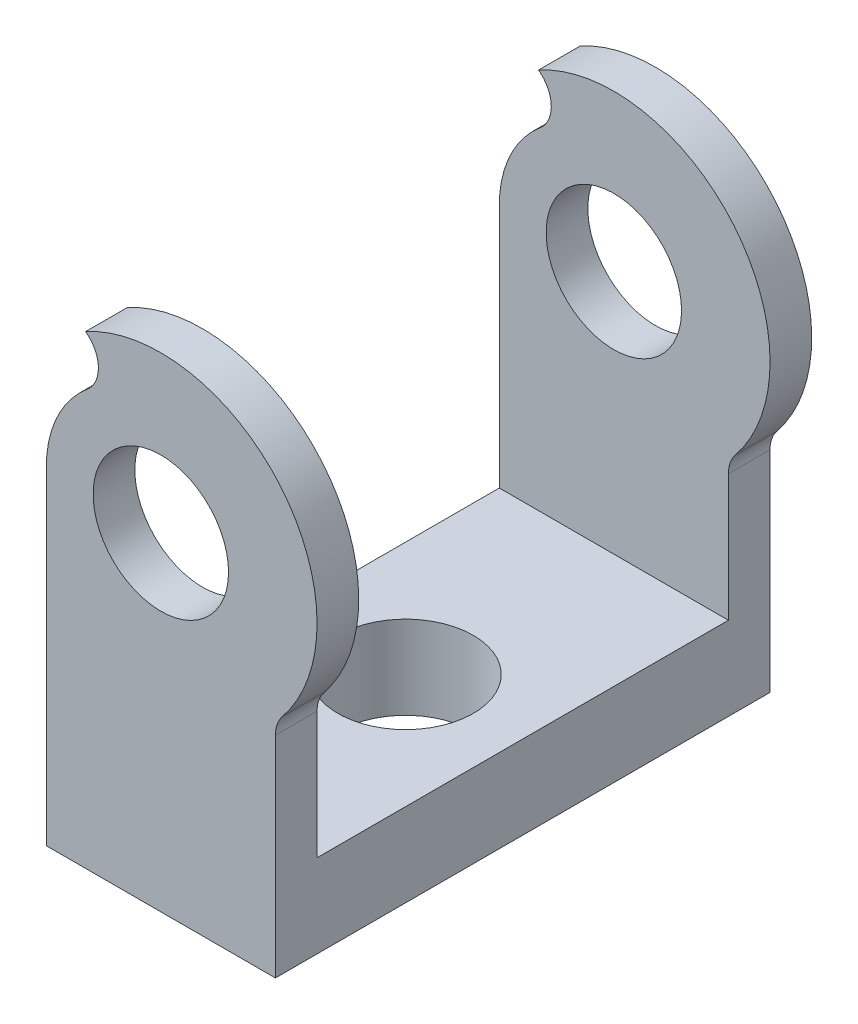
ISO-10303-21;
HEADER;
FILE_DESCRIPTION(('STEP AP214'),'2;1');
FILE_NAME('part.step','',(''),(''),'','','');
FILE_SCHEMA(('AUTOMOTIVE_DESIGN { 1 0 10303 214 1 1 1 1 }'));
ENDSEC;
DATA;
#1=APPLICATION_CONTEXT('core data for automotive mechanical design processes');
#2=APPLICATION_PROTOCOL_DEFINITION('international standard','automotive_design',2000,#1);
#3=PRODUCT_CONTEXT('',#1,'mechanical');
#4=PRODUCT('Part','Part','',(#3));
#5=PRODUCT_RELATED_PRODUCT_CATEGORY('part','',(#4));
#6=PRODUCT_DEFINITION_FORMATION('','',#4);
#7=PRODUCT_DEFINITION_CONTEXT('part definition',#1,'design');
#8=PRODUCT_DEFINITION('design','',#6,#7);
#9=PRODUCT_DEFINITION_SHAPE('','',#8);
#10=(LENGTH_UNIT() NAMED_UNIT(*) SI_UNIT(.MILLI.,.METRE.));
#11=(NAMED_UNIT(*) PLANE_ANGLE_UNIT() SI_UNIT($,.RADIAN.));
#12=(NAMED_UNIT(*) SI_UNIT($,.STERADIAN.) SOLID_ANGLE_UNIT());
#13=UNCERTAINTY_MEASURE_WITH_UNIT(LENGTH_MEASURE(1.E-05),#10,'distance_accuracy_value','');
#14=(GEOMETRIC_REPRESENTATION_CONTEXT(3) GLOBAL_UNCERTAINTY_ASSIGNED_CONTEXT((#13)) GLOBAL_UNIT_ASSIGNED_CONTEXT((#10,
#11,#12)) REPRESENTATION_CONTEXT('',''));
#15=CARTESIAN_POINT('',(0.,0.,0.));
#16=DIRECTION('',(0.,0.,1.));
#17=DIRECTION('',(1.,0.,0.));
#18=AXIS2_PLACEMENT_3D('',#15,#16,#17);
#19=CARTESIAN_POINT('',(0.,0.,4.));
#20=DIRECTION('',(1.,0.,0.));
#21=DIRECTION('',(0.,0.,-1.));
#22=AXIS2_PLACEMENT_3D('',#19,#20,#21);
#23=PLANE('',#22);
#24=DIRECTION('',(0.,-1.,0.));
#25=VECTOR('',#24,1.);
#26=CARTESIAN_POINT('',(0.,0.,0.));
#27=LINE('',#26,#25);
#28=CARTESIAN_POINT('',(0.,31.5,0.));
#29=VERTEX_POINT('',#28);
#30=CARTESIAN_POINT('',(0.,0.,0.));
#31=VERTEX_POINT('',#30);
#32=EDGE_CURVE('E152',#29,#31,#27,.T.);
#33=ORIENTED_EDGE('',*,*,#32,.T.);
#34=DIRECTION('',(0.,0.,-1.));
#35=VECTOR('',#34,1.);
#36=CARTESIAN_POINT('',(0.,0.,4.));
#37=LINE('',#36,#35);
#38=CARTESIAN_POINT('',(0.,0.,47.5));
#39=VERTEX_POINT('',#38);
#40=EDGE_CURVE('E145',#39,#31,#37,.T.);
#41=ORIENTED_EDGE('',*,*,#40,.F.);
#42=DIRECTION('',(0.,-1.,0.));
#43=VECTOR('',#42,1.);
#44=CARTESIAN_POINT('',(0.,0.,47.5));
#45=LINE('',#44,#43);
#46=CARTESIAN_POINT('',(0.,31.5,47.5));
#47=VERTEX_POINT('',#46);
#48=EDGE_CURVE('E149',#47,#39,#45,.T.);
#49=ORIENTED_EDGE('',*,*,#48,.F.);
#50=DIRECTION('',(0.,0.,-1.));
#51=VECTOR('',#50,1.);
#52=CARTESIAN_POINT('',(0.,31.5,47.5));
#53=LINE('',#52,#51);
#54=CARTESIAN_POINT('',(0.,31.5,43.5));
#55=VERTEX_POINT('',#54);
#56=EDGE_CURVE('E192',#47,#55,#53,.T.);
#57=ORIENTED_EDGE('',*,*,#56,.T.);
#58=DIRECTION('',(0.,-1.,0.));
#59=VECTOR('',#58,1.);
#60=CARTESIAN_POINT('',(0.,0.,43.5));
#61=LINE('',#60,#59);
#62=CARTESIAN_POINT('',(0.,8.,43.5));
#63=VERTEX_POINT('',#62);
#64=EDGE_CURVE('E193',#55,#63,#61,.T.);
#65=ORIENTED_EDGE('',*,*,#64,.T.);
#66=DIRECTION('',(0.,0.,-1.));
#67=VECTOR('',#66,1.);
#68=CARTESIAN_POINT('',(0.,8.,43.5));
#69=LINE('',#68,#67);
#70=CARTESIAN_POINT('',(0.,8.,4.));
#71=VERTEX_POINT('',#70);
#72=EDGE_CURVE('E221',#63,#71,#69,.T.);
#73=ORIENTED_EDGE('',*,*,#72,.T.);
#74=DIRECTION('',(0.,-1.,0.));
#75=VECTOR('',#74,1.);
#76=CARTESIAN_POINT('',(0.,0.,4.));
#77=LINE('',#76,#75);
#78=CARTESIAN_POINT('',(0.,31.5,4.));
#79=VERTEX_POINT('',#78);
#80=EDGE_CURVE('E232',#79,#71,#77,.T.);
#81=ORIENTED_EDGE('',*,*,#80,.F.);
#82=DIRECTION('',(0.,0.,-1.));
#83=VECTOR('',#82,1.);
#84=CARTESIAN_POINT('',(0.,31.5,4.));
#85=LINE('',#84,#83);
#86=EDGE_CURVE('E248',#79,#29,#85,.T.);
#87=ORIENTED_EDGE('',*,*,#86,.T.);
#88=EDGE_LOOP('',(#33,#41,#49,#57,#65,#73,#81,#87));
#89=FACE_BOUND('',#88,.T.);
#90=ADVANCED_FACE('F43',(#89),#23,.F.);
#91=CARTESIAN_POINT('',(0.,0.,4.));
#92=DIRECTION('',(0.,1.,0.));
#93=DIRECTION('',(0.,0.,1.));
#94=AXIS2_PLACEMENT_3D('',#91,#92,#93);
#95=PLANE('',#94);
#96=CARTESIAN_POINT('',(11.,0.,24.));
#97=DIRECTION('',(0.,-1.,0.));
#98=DIRECTION('',(0.,0.,-1.));
#99=AXIS2_PLACEMENT_3D('',#96,#97,#98);
#100=CIRCLE('',#99,6.5);
#101=CARTESIAN_POINT('',(11.,0.,17.5));
#102=VERTEX_POINT('',#101);
#103=EDGE_CURVE('E388',#102,#102,#100,.T.);
#104=ORIENTED_EDGE('',*,*,#103,.F.);
#105=EDGE_LOOP('',(#104));
#106=FACE_BOUND('',#105,.T.);
#107=DIRECTION('',(1.,0.,0.));
#108=VECTOR('',#107,1.);
#109=CARTESIAN_POINT('',(0.,0.,0.));
#110=LINE('',#109,#108);
#111=CARTESIAN_POINT('',(22.,0.,0.));
#112=VERTEX_POINT('',#111);
#113=EDGE_CURVE('E251',#31,#112,#110,.T.);
#114=ORIENTED_EDGE('',*,*,#113,.T.);
#115=DIRECTION('',(0.,0.,-1.));
#116=VECTOR('',#115,1.);
#117=CARTESIAN_POINT('',(22.,0.,4.));
#118=LINE('',#117,#116);
#119=CARTESIAN_POINT('',(22.,0.,47.5));
#120=VERTEX_POINT('',#119);
#121=EDGE_CURVE('E156',#120,#112,#118,.T.);
#122=ORIENTED_EDGE('',*,*,#121,.F.);
#123=DIRECTION('',(1.,0.,0.));
#124=VECTOR('',#123,1.);
#125=CARTESIAN_POINT('',(0.,0.,47.5));
#126=LINE('',#125,#124);
#127=EDGE_CURVE('E159',#39,#120,#126,.T.);
#128=ORIENTED_EDGE('',*,*,#127,.F.);
#129=ORIENTED_EDGE('',*,*,#40,.T.);
#130=EDGE_LOOP('',(#114,#122,#128,#129));
#131=FACE_BOUND('',#130,.T.);
#132=ADVANCED_FACE('F160',(#106,#131),#95,.F.);
#133=CARTESIAN_POINT('',(22.,0.,4.));
#134=DIRECTION('',(-1.,0.,0.));
#135=DIRECTION('',(0.,0.,1.));
#136=AXIS2_PLACEMENT_3D('',#133,#134,#135);
#137=PLANE('',#136);
#138=DIRECTION('',(0.,1.,0.));
#139=VECTOR('',#138,1.);
#140=CARTESIAN_POINT('',(22.,0.,43.5));
#141=LINE('',#140,#139);
#142=CARTESIAN_POINT('',(22.,8.,43.5));
#143=VERTEX_POINT('',#142);
#144=CARTESIAN_POINT('',(22.,20.1862915010152,43.5));
#145=VERTEX_POINT('',#144);
#146=EDGE_CURVE('E197',#143,#145,#141,.T.);
#147=ORIENTED_EDGE('',*,*,#146,.T.);
#148=DIRECTION('',(0.,0.,1.));
#149=VECTOR('',#148,1.);
#150=CARTESIAN_POINT('',(22.,20.1862915010152,47.5));
#151=LINE('',#150,#149);
#152=CARTESIAN_POINT('',(22.,20.1862915010152,47.5));
#153=VERTEX_POINT('',#152);
#154=EDGE_CURVE('E284',#145,#153,#151,.T.);
#155=ORIENTED_EDGE('',*,*,#154,.T.);
#156=DIRECTION('',(0.,1.,0.));
#157=VECTOR('',#156,1.);
#158=CARTESIAN_POINT('',(22.,0.,47.5));
#159=LINE('',#158,#157);
#160=EDGE_CURVE('E166',#120,#153,#159,.T.);
#161=ORIENTED_EDGE('',*,*,#160,.F.);
#162=ORIENTED_EDGE('',*,*,#121,.T.);
#163=DIRECTION('',(0.,1.,0.));
#164=VECTOR('',#163,1.);
#165=CARTESIAN_POINT('',(22.,0.,0.));
#166=LINE('',#165,#164);
#167=CARTESIAN_POINT('',(22.,20.1862915010152,0.));
#168=VERTEX_POINT('',#167);
#169=EDGE_CURVE('E254',#112,#168,#166,.T.);
#170=ORIENTED_EDGE('',*,*,#169,.T.);
#171=DIRECTION('',(0.,0.,1.));
#172=VECTOR('',#171,1.);
#173=CARTESIAN_POINT('',(22.,20.1862915010152,4.));
#174=LINE('',#173,#172);
#175=CARTESIAN_POINT('',(22.,20.1862915010152,4.));
#176=VERTEX_POINT('',#175);
#177=EDGE_CURVE('E281',#168,#176,#174,.T.);
#178=ORIENTED_EDGE('',*,*,#177,.T.);
#179=DIRECTION('',(0.,1.,0.));
#180=VECTOR('',#179,1.);
#181=CARTESIAN_POINT('',(22.,0.,4.));
#182=LINE('',#181,#180);
#183=CARTESIAN_POINT('',(22.,8.,4.));
#184=VERTEX_POINT('',#183);
#185=EDGE_CURVE('E235',#184,#176,#182,.T.);
#186=ORIENTED_EDGE('',*,*,#185,.F.);
#187=DIRECTION('',(0.,0.,-1.));
#188=VECTOR('',#187,1.);
#189=CARTESIAN_POINT('',(22.,8.,43.5));
#190=LINE('',#189,#188);
#191=EDGE_CURVE('E228',#143,#184,#190,.T.);
#192=ORIENTED_EDGE('',*,*,#191,.F.);
#193=EDGE_LOOP('',(#147,#155,#161,#162,#170,#178,#186,#192));
#194=FACE_BOUND('',#193,.T.);
#195=ADVANCED_FACE('F302',(#194),#137,.F.);
#196=CARTESIAN_POINT('',(11.,31.5,4.));
#197=DIRECTION('',(0.,0.,-1.));
#198=DIRECTION('',(-1.,0.,0.));
#199=AXIS2_PLACEMENT_3D('',#196,#197,#198);
#200=CYLINDRICAL_SURFACE('',#199,15.);
#201=CARTESIAN_POINT('',(11.,31.5,4.));
#202=DIRECTION('',(0.,0.,1.));
#203=DIRECTION('',(1.,0.,0.));
#204=AXIS2_PLACEMENT_3D('',#201,#202,#203);
#205=CIRCLE('',#204,15.);
#206=CARTESIAN_POINT('',(22.6666666666667,22.0719095841794,4.));
#207=VERTEX_POINT('',#206);
#208=CARTESIAN_POINT('',(3.76462961115535,44.6396124500013,4.));
#209=VERTEX_POINT('',#208);
#210=EDGE_CURVE('E239',#207,#209,#205,.T.);
#211=ORIENTED_EDGE('',*,*,#210,.F.);
#212=DIRECTION('',(0.,0.,-1.));
#213=VECTOR('',#212,1.);
#214=CARTESIAN_POINT('',(22.6666666666667,22.0719095841794,4.));
#215=LINE('',#214,#213);
#216=CARTESIAN_POINT('',(22.6666666666667,22.0719095841794,0.));
#217=VERTEX_POINT('',#216);
#218=EDGE_CURVE('E287',#207,#217,#215,.T.);
#219=ORIENTED_EDGE('',*,*,#218,.T.);
#220=CARTESIAN_POINT('',(11.,31.5,0.));
#221=DIRECTION('',(0.,0.,1.));
#222=DIRECTION('',(1.,0.,0.));
#223=AXIS2_PLACEMENT_3D('',#220,#221,#222);
#224=CIRCLE('',#223,15.);
#225=CARTESIAN_POINT('',(3.76462961115535,44.6396124500013,0.));
#226=VERTEX_POINT('',#225);
#227=EDGE_CURVE('E258',#217,#226,#224,.T.);
#228=ORIENTED_EDGE('',*,*,#227,.T.);
#229=DIRECTION('',(0.,0.,-1.));
#230=VECTOR('',#229,1.);
#231=CARTESIAN_POINT('',(3.76462961115535,44.6396124500013,4.));
#232=LINE('',#231,#230);
#233=EDGE_CURVE('E272',#209,#226,#232,.T.);
#234=ORIENTED_EDGE('',*,*,#233,.F.);
#235=EDGE_LOOP('',(#211,#219,#228,#234));
#236=FACE_BOUND('',#235,.T.);
#237=ADVANCED_FACE('F305',(#236),#200,.T.);
#238=CARTESIAN_POINT('',(1.993424789463,42.2182835835287,4.));
#239=DIRECTION('',(0.,0.,-1.));
#240=DIRECTION('',(-1.,0.,0.));
#241=AXIS2_PLACEMENT_3D('',#238,#239,#240);
#242=CYLINDRICAL_SURFACE('',#241,3.);
#243=CARTESIAN_POINT('',(1.993424789463,42.2182835835287,0.));
#244=DIRECTION('',(0.,0.,-1.));
#245=DIRECTION('',(1.,0.,0.));
#246=AXIS2_PLACEMENT_3D('',#243,#244,#245);
#247=CIRCLE('',#246,3.);
#248=CARTESIAN_POINT('',(3.92340519172093,39.9215085299154,0.));
#249=VERTEX_POINT('',#248);
#250=EDGE_CURVE('E261',#226,#249,#247,.T.);
#251=ORIENTED_EDGE('',*,*,#250,.T.);
#252=DIRECTION('',(0.,0.,-1.));
#253=VECTOR('',#252,1.);
#254=CARTESIAN_POINT('',(3.92340519172093,39.9215085299154,4.));
#255=LINE('',#254,#253);
#256=CARTESIAN_POINT('',(3.92340519172093,39.9215085299154,4.));
#257=VERTEX_POINT('',#256);
#258=EDGE_CURVE('E268',#257,#249,#255,.T.);
#259=ORIENTED_EDGE('',*,*,#258,.F.);
#260=CARTESIAN_POINT('',(1.993424789463,42.2182835835287,4.));
#261=DIRECTION('',(0.,0.,-1.));
#262=DIRECTION('',(1.,0.,0.));
#263=AXIS2_PLACEMENT_3D('',#260,#261,#262);
#264=CIRCLE('',#263,3.);
#265=EDGE_CURVE('E242',#209,#257,#264,.T.);
#266=ORIENTED_EDGE('',*,*,#265,.F.);
#267=ORIENTED_EDGE('',*,*,#233,.T.);
#268=EDGE_LOOP('',(#251,#259,#266,#267));
#269=FACE_BOUND('',#268,.T.);
#270=ADVANCED_FACE('F313',(#269),#242,.F.);
#271=CARTESIAN_POINT('',(11.,31.5,4.));
#272=DIRECTION('',(0.,0.,-1.));
#273=DIRECTION('',(-1.,0.,0.));
#274=AXIS2_PLACEMENT_3D('',#271,#272,#273);
#275=CYLINDRICAL_SURFACE('',#274,11.);
#276=CARTESIAN_POINT('',(11.,31.5,0.));
#277=DIRECTION('',(0.,0.,1.));
#278=DIRECTION('',(1.,0.,0.));
#279=AXIS2_PLACEMENT_3D('',#276,#277,#278);
#280=CIRCLE('',#279,11.);
#281=EDGE_CURVE('E236',#249,#29,#280,.T.);
#282=ORIENTED_EDGE('',*,*,#281,.T.);
#283=ORIENTED_EDGE('',*,*,#86,.F.);
#284=CARTESIAN_POINT('',(11.,31.5,4.));
#285=DIRECTION('',(0.,0.,1.));
#286=DIRECTION('',(1.,0.,0.));
#287=AXIS2_PLACEMENT_3D('',#284,#285,#286);
#288=CIRCLE('',#287,11.);
#289=EDGE_CURVE('E245',#257,#79,#288,.T.);
#290=ORIENTED_EDGE('',*,*,#289,.F.);
#291=ORIENTED_EDGE('',*,*,#258,.T.);
#292=EDGE_LOOP('',(#282,#283,#290,#291));
#293=FACE_BOUND('',#292,.T.);
#294=ADVANCED_FACE('F316',(#293),#275,.T.);
#295=CARTESIAN_POINT('',(11.,31.5,4.));
#296=DIRECTION('',(0.,0.,1.));
#297=DIRECTION('',(1.,0.,0.));
#298=AXIS2_PLACEMENT_3D('',#295,#296,#297);
#299=PLANE('',#298);
#300=CARTESIAN_POINT('',(11.,31.5,4.));
#301=DIRECTION('',(0.,0.,1.));
#302=DIRECTION('',(1.,0.,0.));
#303=AXIS2_PLACEMENT_3D('',#300,#301,#302);
#304=CIRCLE('',#303,6.5);
#305=CARTESIAN_POINT('',(17.5,31.5,4.));
#306=VERTEX_POINT('',#305);
#307=EDGE_CURVE('E179',#306,#306,#304,.T.);
#308=ORIENTED_EDGE('',*,*,#307,.F.);
#309=EDGE_LOOP('',(#308));
#310=FACE_BOUND('',#309,.T.);
#311=DIRECTION('',(-1.,0.,0.));
#312=VECTOR('',#311,1.);
#313=CARTESIAN_POINT('',(0.,8.,4.));
#314=LINE('',#313,#312);
#315=EDGE_CURVE('E216',#184,#71,#314,.T.);
#316=ORIENTED_EDGE('',*,*,#315,.F.);
#317=ORIENTED_EDGE('',*,*,#185,.T.);
#318=CARTESIAN_POINT('',(25.,20.1862915010152,4.));
#319=DIRECTION('',(0.,0.,1.));
#320=DIRECTION('',(1.,0.,0.));
#321=AXIS2_PLACEMENT_3D('',#318,#319,#320);
#322=CIRCLE('',#321,3.);
#323=EDGE_CURVE('E11',#176,#207,#322,.F.);
#324=ORIENTED_EDGE('',*,*,#323,.T.);
#325=ORIENTED_EDGE('',*,*,#210,.T.);
#326=ORIENTED_EDGE('',*,*,#265,.T.);
#327=ORIENTED_EDGE('',*,*,#289,.T.);
#328=ORIENTED_EDGE('',*,*,#80,.T.);
#329=EDGE_LOOP('',(#316,#317,#324,#325,#326,#327,#328));
#330=FACE_BOUND('',#329,.T.);
#331=ADVANCED_FACE('F308',(#310,#330),#299,.T.);
#332=CARTESIAN_POINT('',(11.,31.5,0.));
#333=DIRECTION('',(0.,0.,1.));
#334=DIRECTION('',(1.,0.,0.));
#335=AXIS2_PLACEMENT_3D('',#332,#333,#334);
#336=PLANE('',#335);
#337=CARTESIAN_POINT('',(11.,31.5,0.));
#338=DIRECTION('',(0.,0.,1.));
#339=DIRECTION('',(1.,0.,0.));
#340=AXIS2_PLACEMENT_3D('',#337,#338,#339);
#341=CIRCLE('',#340,6.5);
#342=CARTESIAN_POINT('',(17.5,31.5,0.));
#343=VERTEX_POINT('',#342);
#344=EDGE_CURVE('E398',#343,#343,#341,.T.);
#345=ORIENTED_EDGE('',*,*,#344,.T.);
#346=EDGE_LOOP('',(#345));
#347=FACE_BOUND('',#346,.T.);
#348=ORIENTED_EDGE('',*,*,#32,.F.);
#349=ORIENTED_EDGE('',*,*,#281,.F.);
#350=ORIENTED_EDGE('',*,*,#250,.F.);
#351=ORIENTED_EDGE('',*,*,#227,.F.);
#352=CARTESIAN_POINT('',(25.,20.1862915010152,0.));
#353=DIRECTION('',(0.,0.,1.));
#354=DIRECTION('',(1.,0.,0.));
#355=AXIS2_PLACEMENT_3D('',#352,#353,#354);
#356=CIRCLE('',#355,3.);
#357=EDGE_CURVE('E52',#217,#168,#356,.T.);
#358=ORIENTED_EDGE('',*,*,#357,.T.);
#359=ORIENTED_EDGE('',*,*,#169,.F.);
#360=ORIENTED_EDGE('',*,*,#113,.F.);
#361=EDGE_LOOP('',(#348,#349,#350,#351,#358,#359,#360));
#362=FACE_BOUND('',#361,.T.);
#363=ADVANCED_FACE('F299',(#347,#362),#336,.F.);
#364=CARTESIAN_POINT('',(0.,8.,43.5));
#365=DIRECTION('',(0.,-1.,0.));
#366=DIRECTION('',(0.,0.,-1.));
#367=AXIS2_PLACEMENT_3D('',#364,#365,#366);
#368=PLANE('',#367);
#369=CARTESIAN_POINT('',(11.,8.,24.));
#370=DIRECTION('',(0.,-1.,0.));
#371=DIRECTION('',(0.,0.,-1.));
#372=AXIS2_PLACEMENT_3D('',#369,#370,#371);
#373=CIRCLE('',#372,6.5);
#374=CARTESIAN_POINT('',(11.,8.,17.5));
#375=VERTEX_POINT('',#374);
#376=EDGE_CURVE('E391',#375,#375,#373,.F.);
#377=ORIENTED_EDGE('',*,*,#376,.F.);
#378=EDGE_LOOP('',(#377));
#379=FACE_BOUND('',#378,.T.);
#380=ORIENTED_EDGE('',*,*,#315,.T.);
#381=ORIENTED_EDGE('',*,*,#72,.F.);
#382=DIRECTION('',(-1.,0.,0.));
#383=VECTOR('',#382,1.);
#384=CARTESIAN_POINT('',(0.,8.,43.5));
#385=LINE('',#384,#383);
#386=EDGE_CURVE('E217',#143,#63,#385,.T.);
#387=ORIENTED_EDGE('',*,*,#386,.F.);
#388=ORIENTED_EDGE('',*,*,#191,.T.);
#389=EDGE_LOOP('',(#380,#381,#387,#388));
#390=FACE_BOUND('',#389,.T.);
#391=ADVANCED_FACE('F319',(#379,#390),#368,.F.);
#392=CARTESIAN_POINT('',(11.,31.5,43.5));
#393=DIRECTION('',(0.,0.,1.));
#394=DIRECTION('',(1.,0.,0.));
#395=AXIS2_PLACEMENT_3D('',#392,#393,#394);
#396=PLANE('',#395);
#397=CARTESIAN_POINT('',(11.,31.5,43.5));
#398=DIRECTION('',(0.,0.,1.));
#399=DIRECTION('',(1.,0.,0.));
#400=AXIS2_PLACEMENT_3D('',#397,#398,#399);
#401=CIRCLE('',#400,6.5);
#402=CARTESIAN_POINT('',(17.5,31.5,43.5));
#403=VERTEX_POINT('',#402);
#404=EDGE_CURVE('E404',#403,#403,#401,.T.);
#405=ORIENTED_EDGE('',*,*,#404,.T.);
#406=EDGE_LOOP('',(#405));
#407=FACE_BOUND('',#406,.T.);
#408=ORIENTED_EDGE('',*,*,#146,.F.);
#409=ORIENTED_EDGE('',*,*,#386,.T.);
#410=ORIENTED_EDGE('',*,*,#64,.F.);
#411=CARTESIAN_POINT('',(11.,31.5,43.5));
#412=DIRECTION('',(0.,0.,1.));
#413=DIRECTION('',(1.,0.,0.));
#414=AXIS2_PLACEMENT_3D('',#411,#412,#413);
#415=CIRCLE('',#414,11.);
#416=CARTESIAN_POINT('',(3.92933629344802,39.9264888743087,43.5));
#417=VERTEX_POINT('',#416);
#418=EDGE_CURVE('E173',#417,#55,#415,.T.);
#419=ORIENTED_EDGE('',*,*,#418,.F.);
#420=CARTESIAN_POINT('',(2.0009734643884,42.2246222036657,43.5));
#421=DIRECTION('',(0.,0.,-1.));
#422=DIRECTION('',(1.,0.,0.));
#423=AXIS2_PLACEMENT_3D('',#420,#421,#422);
#424=CIRCLE('',#423,3.);
#425=CARTESIAN_POINT('',(3.77388263675114,44.6447034144005,43.5));
#426=VERTEX_POINT('',#425);
#427=EDGE_CURVE('E176',#426,#417,#424,.T.);
#428=ORIENTED_EDGE('',*,*,#427,.F.);
#429=CARTESIAN_POINT('',(11.,31.5,43.5));
#430=DIRECTION('',(0.,0.,1.));
#431=DIRECTION('',(1.,0.,0.));
#432=AXIS2_PLACEMENT_3D('',#429,#430,#431);
#433=CIRCLE('',#432,15.);
#434=CARTESIAN_POINT('',(22.6666666666667,22.0719095841794,43.5));
#435=VERTEX_POINT('',#434);
#436=EDGE_CURVE('E201',#435,#426,#433,.T.);
#437=ORIENTED_EDGE('',*,*,#436,.F.);
#438=CARTESIAN_POINT('',(25.,20.1862915010152,43.5));
#439=DIRECTION('',(0.,0.,1.));
#440=DIRECTION('',(1.,0.,0.));
#441=AXIS2_PLACEMENT_3D('',#438,#439,#440);
#442=CIRCLE('',#441,3.);
#443=EDGE_CURVE('E290',#435,#145,#442,.T.);
#444=ORIENTED_EDGE('',*,*,#443,.T.);
#445=EDGE_LOOP('',(#408,#409,#410,#419,#428,#437,#444));
#446=FACE_BOUND('',#445,.T.);
#447=ADVANCED_FACE('F342',(#407,#446),#396,.F.);
#448=CARTESIAN_POINT('',(11.,31.5,47.5));
#449=DIRECTION('',(0.,0.,-1.));
#450=DIRECTION('',(-1.,0.,0.));
#451=AXIS2_PLACEMENT_3D('',#448,#449,#450);
#452=CYLINDRICAL_SURFACE('',#451,15.);
#453=CARTESIAN_POINT('',(11.,31.5,47.5));
#454=DIRECTION('',(0.,0.,1.));
#455=DIRECTION('',(1.,0.,0.));
#456=AXIS2_PLACEMENT_3D('',#453,#454,#455);
#457=CIRCLE('',#456,15.);
#458=CARTESIAN_POINT('',(22.6666666666667,22.0719095841794,47.5));
#459=VERTEX_POINT('',#458);
#460=CARTESIAN_POINT('',(3.77388263675114,44.6447034144005,47.5));
#461=VERTEX_POINT('',#460);
#462=EDGE_CURVE('E184',#459,#461,#457,.T.);
#463=ORIENTED_EDGE('',*,*,#462,.F.);
#464=DIRECTION('',(0.,0.,-1.));
#465=VECTOR('',#464,1.);
#466=CARTESIAN_POINT('',(22.6666666666667,22.0719095841794,47.5));
#467=LINE('',#466,#465);
#468=EDGE_CURVE('E155',#459,#435,#467,.T.);
#469=ORIENTED_EDGE('',*,*,#468,.T.);
#470=ORIENTED_EDGE('',*,*,#436,.T.);
#471=DIRECTION('',(0.,0.,-1.));
#472=VECTOR('',#471,1.);
#473=CARTESIAN_POINT('',(3.77388263675114,44.6447034144005,47.5));
#474=LINE('',#473,#472);
#475=EDGE_CURVE('E212',#461,#426,#474,.T.);
#476=ORIENTED_EDGE('',*,*,#475,.F.);
#477=EDGE_LOOP('',(#463,#469,#470,#476));
#478=FACE_BOUND('',#477,.T.);
#479=ADVANCED_FACE('F331',(#478),#452,.T.);
#480=CARTESIAN_POINT('',(2.0009734643884,42.2246222036657,47.5));
#481=DIRECTION('',(0.,0.,-1.));
#482=DIRECTION('',(-1.,0.,0.));
#483=AXIS2_PLACEMENT_3D('',#480,#481,#482);
#484=CYLINDRICAL_SURFACE('',#483,3.);
#485=ORIENTED_EDGE('',*,*,#427,.T.);
#486=DIRECTION('',(0.,0.,-1.));
#487=VECTOR('',#486,1.);
#488=CARTESIAN_POINT('',(3.92933629344802,39.9264888743087,47.5));
#489=LINE('',#488,#487);
#490=CARTESIAN_POINT('',(3.92933629344802,39.9264888743087,47.5));
#491=VERTEX_POINT('',#490);
#492=EDGE_CURVE('E208',#491,#417,#489,.T.);
#493=ORIENTED_EDGE('',*,*,#492,.F.);
#494=CARTESIAN_POINT('',(2.0009734643884,42.2246222036657,47.5));
#495=DIRECTION('',(0.,0.,-1.));
#496=DIRECTION('',(1.,0.,0.));
#497=AXIS2_PLACEMENT_3D('',#494,#495,#496);
#498=CIRCLE('',#497,3.);
#499=EDGE_CURVE('E187',#461,#491,#498,.T.);
#500=ORIENTED_EDGE('',*,*,#499,.F.);
#501=ORIENTED_EDGE('',*,*,#475,.T.);
#502=EDGE_LOOP('',(#485,#493,#500,#501));
#503=FACE_BOUND('',#502,.T.);
#504=ADVANCED_FACE('F337',(#503),#484,.F.);
#505=CARTESIAN_POINT('',(11.,31.5,47.5));
#506=DIRECTION('',(0.,0.,-1.));
#507=DIRECTION('',(-1.,0.,0.));
#508=AXIS2_PLACEMENT_3D('',#505,#506,#507);
#509=CYLINDRICAL_SURFACE('',#508,11.);
#510=ORIENTED_EDGE('',*,*,#418,.T.);
#511=ORIENTED_EDGE('',*,*,#56,.F.);
#512=CARTESIAN_POINT('',(11.,31.5,47.5));
#513=DIRECTION('',(0.,0.,1.));
#514=DIRECTION('',(1.,0.,0.));
#515=AXIS2_PLACEMENT_3D('',#512,#513,#514);
#516=CIRCLE('',#515,11.);
#517=EDGE_CURVE('E170',#491,#47,#516,.T.);
#518=ORIENTED_EDGE('',*,*,#517,.F.);
#519=ORIENTED_EDGE('',*,*,#492,.T.);
#520=EDGE_LOOP('',(#510,#511,#518,#519));
#521=FACE_BOUND('',#520,.T.);
#522=ADVANCED_FACE('F340',(#521),#509,.T.);
#523=CARTESIAN_POINT('',(11.,31.5,47.5));
#524=DIRECTION('',(0.,0.,1.));
#525=DIRECTION('',(1.,0.,0.));
#526=AXIS2_PLACEMENT_3D('',#523,#524,#525);
#527=PLANE('',#526);
#528=CARTESIAN_POINT('',(11.,31.5,47.5));
#529=DIRECTION('',(0.,0.,1.));
#530=DIRECTION('',(1.,0.,0.));
#531=AXIS2_PLACEMENT_3D('',#528,#529,#530);
#532=CIRCLE('',#531,6.5);
#533=CARTESIAN_POINT('',(17.5,31.5,47.5));
#534=VERTEX_POINT('',#533);
#535=EDGE_CURVE('E393',#534,#534,#532,.T.);
#536=ORIENTED_EDGE('',*,*,#535,.F.);
#537=EDGE_LOOP('',(#536));
#538=FACE_BOUND('',#537,.T.);
#539=ORIENTED_EDGE('',*,*,#48,.T.);
#540=ORIENTED_EDGE('',*,*,#127,.T.);
#541=ORIENTED_EDGE('',*,*,#160,.T.);
#542=CARTESIAN_POINT('',(25.,20.1862915010152,47.5));
#543=DIRECTION('',(0.,0.,1.));
#544=DIRECTION('',(1.,0.,0.));
#545=AXIS2_PLACEMENT_3D('',#542,#543,#544);
#546=CIRCLE('',#545,3.);
#547=EDGE_CURVE('E293',#153,#459,#546,.F.);
#548=ORIENTED_EDGE('',*,*,#547,.T.);
#549=ORIENTED_EDGE('',*,*,#462,.T.);
#550=ORIENTED_EDGE('',*,*,#499,.T.);
#551=ORIENTED_EDGE('',*,*,#517,.T.);
#552=EDGE_LOOP('',(#539,#540,#541,#548,#549,#550,#551));
#553=FACE_BOUND('',#552,.T.);
#554=ADVANCED_FACE('F168',(#538,#553),#527,.T.);
#555=CARTESIAN_POINT('',(25.,20.1862915010152,47.5));
#556=DIRECTION('',(0.,0.,-1.));
#557=DIRECTION('',(-1.,0.,0.));
#558=AXIS2_PLACEMENT_3D('',#555,#556,#557);
#559=CYLINDRICAL_SURFACE('',#558,3.);
#560=ORIENTED_EDGE('',*,*,#547,.F.);
#561=ORIENTED_EDGE('',*,*,#154,.F.);
#562=ORIENTED_EDGE('',*,*,#443,.F.);
#563=ORIENTED_EDGE('',*,*,#468,.F.);
#564=EDGE_LOOP('',(#560,#561,#562,#563));
#565=FACE_BOUND('',#564,.T.);
#566=ADVANCED_FACE('F326',(#565),#559,.F.);
#567=CARTESIAN_POINT('',(25.,20.1862915010152,4.));
#568=DIRECTION('',(0.,0.,-1.));
#569=DIRECTION('',(-1.,0.,0.));
#570=AXIS2_PLACEMENT_3D('',#567,#568,#569);
#571=CYLINDRICAL_SURFACE('',#570,3.);
#572=ORIENTED_EDGE('',*,*,#323,.F.);
#573=ORIENTED_EDGE('',*,*,#177,.F.);
#574=ORIENTED_EDGE('',*,*,#357,.F.);
#575=ORIENTED_EDGE('',*,*,#218,.F.);
#576=EDGE_LOOP('',(#572,#573,#574,#575));
#577=FACE_BOUND('',#576,.T.);
#578=ADVANCED_FACE('F45',(#577),#571,.F.);
#579=CARTESIAN_POINT('',(11.,31.5,0.));
#580=DIRECTION('',(0.,0.,1.));
#581=DIRECTION('',(1.,0.,0.));
#582=AXIS2_PLACEMENT_3D('',#579,#580,#581);
#583=CYLINDRICAL_SURFACE('',#582,6.5);
#584=ORIENTED_EDGE('',*,*,#535,.T.);
#585=EDGE_LOOP('',(#584));
#586=FACE_BOUND('',#585,.T.);
#587=ORIENTED_EDGE('',*,*,#404,.F.);
#588=EDGE_LOOP('',(#587));
#589=FACE_BOUND('',#588,.T.);
#590=ADVANCED_FACE('F369',(#586,#589),#583,.F.);
#591=ORIENTED_EDGE('',*,*,#307,.T.);
#592=EDGE_LOOP('',(#591));
#593=FACE_BOUND('',#592,.T.);
#594=ORIENTED_EDGE('',*,*,#344,.F.);
#595=EDGE_LOOP('',(#594));
#596=FACE_BOUND('',#595,.T.);
#597=ADVANCED_FACE('F376',(#593,#596),#583,.F.);
#598=CARTESIAN_POINT('',(11.,46.501,24.));
#599=DIRECTION('',(0.,-1.,0.));
#600=DIRECTION('',(0.,0.,-1.));
#601=AXIS2_PLACEMENT_3D('',#598,#599,#600);
#602=CYLINDRICAL_SURFACE('',#601,6.5);
#603=CARTESIAN_POINT('',(11.,0.,17.5));
#604=CARTESIAN_POINT('',(11.,0.0833333333333402,17.5));
#605=CARTESIAN_POINT('',(11.,0.166666666666674,17.5));
#606=CARTESIAN_POINT('',(11.,0.333333333333341,17.5));
#607=CARTESIAN_POINT('',(11.,0.416666666666674,17.5));
#608=CARTESIAN_POINT('',(11.,0.583333333333341,17.5));
#609=CARTESIAN_POINT('',(11.,0.666666666666674,17.5));
#610=CARTESIAN_POINT('',(11.,0.833333333333341,17.5));
#611=CARTESIAN_POINT('',(11.,0.916666666666674,17.5));
#612=CARTESIAN_POINT('',(11.,1.08333333333334,17.5));
#613=CARTESIAN_POINT('',(11.,1.16666666666667,17.5));
#614=CARTESIAN_POINT('',(11.,1.33333333333334,17.5));
#615=CARTESIAN_POINT('',(11.,1.41666666666667,17.5));
#616=CARTESIAN_POINT('',(11.,1.58333333333334,17.5));
#617=CARTESIAN_POINT('',(11.,1.66666666666667,17.5));
#618=CARTESIAN_POINT('',(11.,1.83333333333334,17.5));
#619=CARTESIAN_POINT('',(11.,1.91666666666668,17.5));
#620=CARTESIAN_POINT('',(11.,2.08333333333334,17.5));
#621=CARTESIAN_POINT('',(11.,2.16666666666667,17.5));
#622=CARTESIAN_POINT('',(11.,2.33333333333334,17.5));
#623=CARTESIAN_POINT('',(11.,2.41666666666667,17.5));
#624=CARTESIAN_POINT('',(11.,2.58333333333334,17.5));
#625=CARTESIAN_POINT('',(11.,2.66666666666667,17.5));
#626=CARTESIAN_POINT('',(11.,2.83333333333334,17.5));
#627=CARTESIAN_POINT('',(11.,2.91666666666667,17.5));
#628=CARTESIAN_POINT('',(11.,3.08333333333334,17.5));
#629=CARTESIAN_POINT('',(11.,3.16666666666667,17.5));
#630=CARTESIAN_POINT('',(11.,3.33333333333334,17.5));
#631=CARTESIAN_POINT('',(11.,3.41666666666667,17.5));
#632=CARTESIAN_POINT('',(11.,3.58333333333334,17.5));
#633=CARTESIAN_POINT('',(11.,3.66666666666667,17.5));
#634=CARTESIAN_POINT('',(11.,3.83333333333334,17.5));
#635=CARTESIAN_POINT('',(11.,3.91666666666667,17.5));
#636=CARTESIAN_POINT('',(11.,4.08333333333334,17.5));
#637=CARTESIAN_POINT('',(11.,4.16666666666667,17.5));
#638=CARTESIAN_POINT('',(11.,4.33333333333334,17.5));
#639=CARTESIAN_POINT('',(11.,4.41666666666667,17.5));
#640=CARTESIAN_POINT('',(11.,4.58333333333334,17.5));
#641=CARTESIAN_POINT('',(11.,4.66666666666667,17.5));
#642=CARTESIAN_POINT('',(11.,4.83333333333334,17.5));
#643=CARTESIAN_POINT('',(11.,4.91666666666667,17.5));
#644=CARTESIAN_POINT('',(11.,5.08333333333334,17.5));
#645=CARTESIAN_POINT('',(11.,5.16666666666667,17.5));
#646=CARTESIAN_POINT('',(11.,5.33333333333334,17.5));
#647=CARTESIAN_POINT('',(11.,5.41666666666667,17.5));
#648=CARTESIAN_POINT('',(11.,5.58333333333334,17.5));
#649=CARTESIAN_POINT('',(11.,5.66666666666667,17.5));
#650=CARTESIAN_POINT('',(11.,5.83333333333333,17.5));
#651=CARTESIAN_POINT('',(11.,5.91666666666666,17.5));
#652=CARTESIAN_POINT('',(11.,6.08333333333333,17.5));
#653=CARTESIAN_POINT('',(11.,6.16666666666667,17.5));
#654=CARTESIAN_POINT('',(11.,6.33333333333333,17.5));
#655=CARTESIAN_POINT('',(11.,6.41666666666667,17.5));
#656=CARTESIAN_POINT('',(11.,6.58333333333333,17.5));
#657=CARTESIAN_POINT('',(11.,6.66666666666667,17.5));
#658=CARTESIAN_POINT('',(11.,6.83333333333333,17.5));
#659=CARTESIAN_POINT('',(11.,6.91666666666667,17.5));
#660=CARTESIAN_POINT('',(11.,7.08333333333333,17.5));
#661=CARTESIAN_POINT('',(11.,7.16666666666667,17.5));
#662=CARTESIAN_POINT('',(11.,7.33333333333333,17.5));
#663=CARTESIAN_POINT('',(11.,7.41666666666667,17.5));
#664=CARTESIAN_POINT('',(11.,7.58333333333333,17.5));
#665=CARTESIAN_POINT('',(11.,7.66666666666667,17.5));
#666=CARTESIAN_POINT('',(11.,7.83333333333333,17.5));
#667=CARTESIAN_POINT('',(11.,7.91666666666667,17.5));
#668=CARTESIAN_POINT('',(11.,8.,17.5));
#669=B_SPLINE_CURVE_WITH_KNOTS('',3,(#603,#604,#605,#606,#607,#608,#609,#610,#611,#612,#613,
#614,#615,#616,#617,#618,#619,#620,#621,#622,#623,#624,#625,#626,#627,#628,#629,#630,#631,#632,
#633,#634,#635,#636,#637,#638,#639,#640,#641,#642,#643,#644,#645,#646,#647,#648,#649,#650,#651,
#652,#653,#654,#655,#656,#657,#658,#659,#660,#661,#662,#663,#664,#665,#666,#667,#668),
.UNSPECIFIED.,.F.,.F.,(4,2,2,2,2,2,2,2,2,2,2,2,2,2,2,2,2,2,2,2,2,2,2,2,2,2,2,2,2,2,2,2,4),(0.,
0.25,0.5,0.750000000000001,1.,1.25,1.5,1.75,2.,2.25,2.5,2.75,3.,3.25,3.5,3.75,4.,4.25,4.5,4.75,
5.,5.25,5.5,5.74999999999999,5.99999999999999,6.24999999999999,6.49999999999999,
6.74999999999999,6.99999999999999,7.24999999999999,7.49999999999999,7.74999999999999,
7.99999999999999),.UNSPECIFIED.);
#670=EDGE_CURVE('BSEAM379',#102,#375,#669,.T.);
#671=ORIENTED_EDGE('',*,*,#103,.T.);
#672=ORIENTED_EDGE('',*,*,#376,.T.);
#673=ORIENTED_EDGE('',*,*,#670,.T.);
#674=ORIENTED_EDGE('',*,*,#670,.F.);
#675=EDGE_LOOP('',(#671,#673,#672,#674));
#676=FACE_BOUND('',#675,.T.);
#677=ADVANCED_FACE('F379',(#676),#602,.F.);
#678=CLOSED_SHELL('',(#90,#132,#195,#237,#270,#294,#331,#363,#391,#447,#479,#504,#522,#554,#566,
#578,#590,#597,#677));
#679=MANIFOLD_SOLID_BREP('B2',#678);
#680=ADVANCED_BREP_SHAPE_REPRESENTATION('',(#18,#679),#14);
#681=SHAPE_DEFINITION_REPRESENTATION(#9,#680);
ENDSEC;
END-ISO-10303-21;
